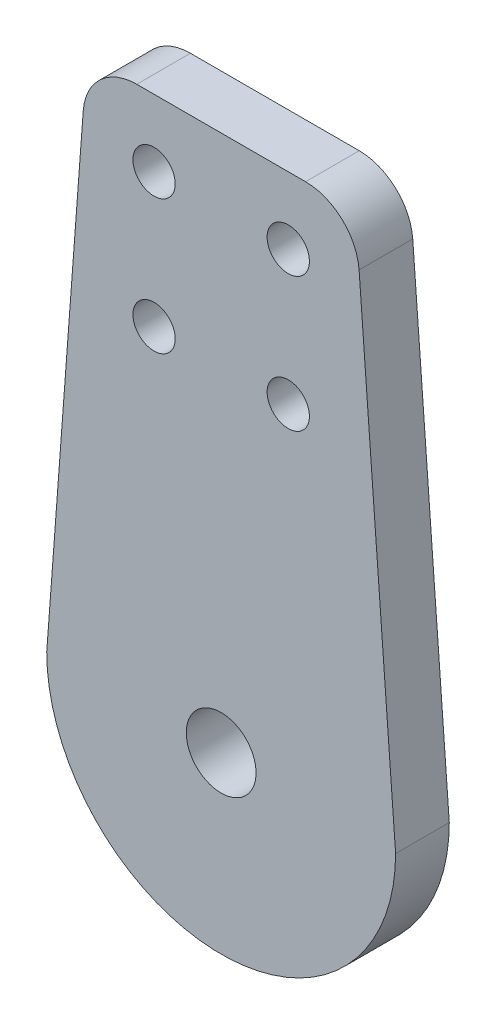
ISO-10303-21;
HEADER;
FILE_DESCRIPTION(('STEP AP214'),'2;1');
FILE_NAME('part.step','',(''),(''),'','','');
FILE_SCHEMA(('AUTOMOTIVE_DESIGN { 1 0 10303 214 1 1 1 1 }'));
ENDSEC;
DATA;
#1=APPLICATION_CONTEXT('core data for automotive mechanical design processes');
#2=APPLICATION_PROTOCOL_DEFINITION('international standard','automotive_design',2000,#1);
#3=PRODUCT_CONTEXT('',#1,'mechanical');
#4=PRODUCT('Part','Part','',(#3));
#5=PRODUCT_RELATED_PRODUCT_CATEGORY('part','',(#4));
#6=PRODUCT_DEFINITION_FORMATION('','',#4);
#7=PRODUCT_DEFINITION_CONTEXT('part definition',#1,'design');
#8=PRODUCT_DEFINITION('design','',#6,#7);
#9=PRODUCT_DEFINITION_SHAPE('','',#8);
#10=(LENGTH_UNIT() NAMED_UNIT(*) SI_UNIT(.MILLI.,.METRE.));
#11=(NAMED_UNIT(*) PLANE_ANGLE_UNIT() SI_UNIT($,.RADIAN.));
#12=(NAMED_UNIT(*) SI_UNIT($,.STERADIAN.) SOLID_ANGLE_UNIT());
#13=UNCERTAINTY_MEASURE_WITH_UNIT(LENGTH_MEASURE(1.E-05),#10,'distance_accuracy_value','');
#14=(GEOMETRIC_REPRESENTATION_CONTEXT(3) GLOBAL_UNCERTAINTY_ASSIGNED_CONTEXT((#13)) GLOBAL_UNIT_ASSIGNED_CONTEXT((#10,
#11,#12)) REPRESENTATION_CONTEXT('',''));
#15=CARTESIAN_POINT('',(0.,0.,0.));
#16=DIRECTION('',(0.,0.,1.));
#17=DIRECTION('',(1.,0.,0.));
#18=AXIS2_PLACEMENT_3D('',#15,#16,#17);
#19=CARTESIAN_POINT('',(0.,0.,4.));
#20=DIRECTION('',(0.,-1.,0.));
#21=DIRECTION('',(0.,0.,-1.));
#22=AXIS2_PLACEMENT_3D('',#19,#20,#21);
#23=PLANE('',#22);
#24=DIRECTION('',(-1.,0.,0.));
#25=VECTOR('',#24,1.);
#26=CARTESIAN_POINT('',(0.,0.,4.));
#27=LINE('',#26,#25);
#28=CARTESIAN_POINT('',(16.2887657759737,0.,4.));
#29=VERTEX_POINT('',#28);
#30=CARTESIAN_POINT('',(3.71123422402632,0.,4.));
#31=VERTEX_POINT('',#30);
#32=EDGE_CURVE('E151',#29,#31,#27,.T.);
#33=ORIENTED_EDGE('',*,*,#32,.F.);
#34=DIRECTION('',(0.,0.,-1.));
#35=VECTOR('',#34,1.);
#36=CARTESIAN_POINT('',(16.2887657759737,0.,4.));
#37=LINE('',#36,#35);
#38=CARTESIAN_POINT('',(16.2887657759737,0.,0.));
#39=VERTEX_POINT('',#38);
#40=EDGE_CURVE('E157',#29,#39,#37,.T.);
#41=ORIENTED_EDGE('',*,*,#40,.T.);
#42=DIRECTION('',(-1.,0.,0.));
#43=VECTOR('',#42,1.);
#44=CARTESIAN_POINT('',(0.,0.,0.));
#45=LINE('',#44,#43);
#46=CARTESIAN_POINT('',(3.71123422402632,0.,0.));
#47=VERTEX_POINT('',#46);
#48=EDGE_CURVE('E148',#39,#47,#45,.T.);
#49=ORIENTED_EDGE('',*,*,#48,.T.);
#50=DIRECTION('',(0.,0.,-1.));
#51=VECTOR('',#50,1.);
#52=CARTESIAN_POINT('',(3.71123422402632,0.,4.));
#53=LINE('',#52,#51);
#54=EDGE_CURVE('E153',#47,#31,#53,.F.);
#55=ORIENTED_EDGE('',*,*,#54,.T.);
#56=EDGE_LOOP('',(#33,#41,#49,#55));
#57=FACE_BOUND('',#56,.T.);
#58=ADVANCED_FACE('F42',(#57),#23,.F.);
#59=CARTESIAN_POINT('',(0.,0.,4.));
#60=DIRECTION('',(0.,0.,1.));
#61=DIRECTION('',(1.,0.,0.));
#62=AXIS2_PLACEMENT_3D('',#59,#60,#61);
#63=PLANE('',#62);
#64=CARTESIAN_POINT('',(10.,-40.,4.));
#65=DIRECTION('',(0.,0.,-1.));
#66=DIRECTION('',(-1.,0.,0.));
#67=AXIS2_PLACEMENT_3D('',#64,#65,#66);
#68=CIRCLE('',#67,2.6);
#69=CARTESIAN_POINT('',(7.4,-40.,4.));
#70=VERTEX_POINT('',#69);
#71=EDGE_CURVE('E123',#70,#70,#68,.T.);
#72=ORIENTED_EDGE('',*,*,#71,.T.);
#73=EDGE_LOOP('',(#72));
#74=FACE_BOUND('',#73,.T.);
#75=CARTESIAN_POINT('',(5.,-15.,4.));
#76=DIRECTION('',(0.,0.,1.));
#77=DIRECTION('',(-1.,0.,0.));
#78=AXIS2_PLACEMENT_3D('',#75,#76,#77);
#79=CIRCLE('',#78,1.575);
#80=CARTESIAN_POINT('',(3.425,-15.,4.));
#81=VERTEX_POINT('',#80);
#82=EDGE_CURVE('E139',#81,#81,#79,.T.);
#83=ORIENTED_EDGE('',*,*,#82,.F.);
#84=EDGE_LOOP('',(#83));
#85=FACE_BOUND('',#84,.T.);
#86=CARTESIAN_POINT('',(15.,-15.,4.));
#87=DIRECTION('',(0.,0.,1.));
#88=DIRECTION('',(1.,0.,0.));
#89=AXIS2_PLACEMENT_3D('',#86,#87,#88);
#90=CIRCLE('',#89,1.575);
#91=CARTESIAN_POINT('',(16.575,-15.,4.));
#92=VERTEX_POINT('',#91);
#93=EDGE_CURVE('E133',#92,#92,#90,.T.);
#94=ORIENTED_EDGE('',*,*,#93,.F.);
#95=EDGE_LOOP('',(#94));
#96=FACE_BOUND('',#95,.T.);
#97=CARTESIAN_POINT('',(15.,-5.,4.));
#98=DIRECTION('',(0.,0.,1.));
#99=DIRECTION('',(-1.,0.,0.));
#100=AXIS2_PLACEMENT_3D('',#97,#98,#99);
#101=CIRCLE('',#100,1.575);
#102=CARTESIAN_POINT('',(13.425,-5.,4.));
#103=VERTEX_POINT('',#102);
#104=EDGE_CURVE('E126',#103,#103,#101,.T.);
#105=ORIENTED_EDGE('',*,*,#104,.F.);
#106=EDGE_LOOP('',(#105));
#107=FACE_BOUND('',#106,.T.);
#108=CARTESIAN_POINT('',(5.,-5.,4.));
#109=DIRECTION('',(0.,0.,1.));
#110=DIRECTION('',(1.,0.,0.));
#111=AXIS2_PLACEMENT_3D('',#108,#109,#110);
#112=CIRCLE('',#111,1.575);
#113=CARTESIAN_POINT('',(6.575,-5.,4.));
#114=VERTEX_POINT('',#113);
#115=EDGE_CURVE('E129',#114,#114,#112,.T.);
#116=ORIENTED_EDGE('',*,*,#115,.F.);
#117=EDGE_LOOP('',(#116));
#118=FACE_BOUND('',#117,.T.);
#119=DIRECTION('',(-0.0747899482416342,0.997199309888456,0.));
#120=VECTOR('',#119,1.);
#121=CARTESIAN_POINT('',(19.8881292728403,1.49160969546302,4.));
#122=LINE('',#121,#120);
#123=CARTESIAN_POINT('',(23.,-40.,4.));
#124=VERTEX_POINT('',#123);
#125=CARTESIAN_POINT('',(20.2775630155275,-3.70084020703346,4.));
#126=VERTEX_POINT('',#125);
#127=EDGE_CURVE('E122',#124,#126,#122,.T.);
#128=ORIENTED_EDGE('',*,*,#127,.T.);
#129=CARTESIAN_POINT('',(16.2887657759737,-4.,4.));
#130=DIRECTION('',(0.,0.,1.));
#131=DIRECTION('',(1.,0.,0.));
#132=AXIS2_PLACEMENT_3D('',#129,#130,#131);
#133=CIRCLE('',#132,4.);
#134=EDGE_CURVE('E50',#126,#29,#133,.T.);
#135=ORIENTED_EDGE('',*,*,#134,.T.);
#136=ORIENTED_EDGE('',*,*,#32,.T.);
#137=CARTESIAN_POINT('',(3.71123422402632,-4.,4.));
#138=DIRECTION('',(0.,0.,1.));
#139=DIRECTION('',(1.,0.,0.));
#140=AXIS2_PLACEMENT_3D('',#137,#138,#139);
#141=CIRCLE('',#140,4.);
#142=CARTESIAN_POINT('',(-0.277563015527511,-3.70084020703346,4.));
#143=VERTEX_POINT('',#142);
#144=EDGE_CURVE('E57',#31,#143,#141,.T.);
#145=ORIENTED_EDGE('',*,*,#144,.T.);
#146=DIRECTION('',(0.0747899482416345,0.997199309888456,0.));
#147=VECTOR('',#146,1.);
#148=CARTESIAN_POINT('',(0.,0.,4.));
#149=LINE('',#148,#147);
#150=CARTESIAN_POINT('',(-3.00000000000001,-40.,4.));
#151=VERTEX_POINT('',#150);
#152=EDGE_CURVE('E95',#151,#143,#149,.T.);
#153=ORIENTED_EDGE('',*,*,#152,.F.);
#154=CARTESIAN_POINT('',(10.,-40.,4.));
#155=DIRECTION('',(0.,0.,1.));
#156=DIRECTION('',(1.,0.,0.));
#157=AXIS2_PLACEMENT_3D('',#154,#155,#156);
#158=CIRCLE('',#157,13.);
#159=EDGE_CURVE('E99',#124,#151,#158,.F.);
#160=ORIENTED_EDGE('',*,*,#159,.F.);
#161=EDGE_LOOP('',(#128,#135,#136,#145,#153,#160));
#162=FACE_BOUND('',#161,.T.);
#163=ADVANCED_FACE('F97',(#74,#85,#96,#107,#118,#162),#63,.T.);
#164=CARTESIAN_POINT('',(0.,0.,0.));
#165=DIRECTION('',(0.,0.,1.));
#166=DIRECTION('',(1.,0.,0.));
#167=AXIS2_PLACEMENT_3D('',#164,#165,#166);
#168=PLANE('',#167);
#169=CARTESIAN_POINT('',(10.,-40.,0.));
#170=DIRECTION('',(0.,0.,-1.));
#171=DIRECTION('',(-1.,0.,0.));
#172=AXIS2_PLACEMENT_3D('',#169,#170,#171);
#173=CIRCLE('',#172,2.6);
#174=CARTESIAN_POINT('',(7.4,-40.,0.));
#175=VERTEX_POINT('',#174);
#176=EDGE_CURVE('E203',#175,#175,#173,.T.);
#177=ORIENTED_EDGE('',*,*,#176,.F.);
#178=EDGE_LOOP('',(#177));
#179=FACE_BOUND('',#178,.T.);
#180=CARTESIAN_POINT('',(5.,-15.,0.));
#181=DIRECTION('',(0.,0.,1.));
#182=DIRECTION('',(-1.,0.,0.));
#183=AXIS2_PLACEMENT_3D('',#180,#181,#182);
#184=CIRCLE('',#183,1.575);
#185=CARTESIAN_POINT('',(3.425,-15.,0.));
#186=VERTEX_POINT('',#185);
#187=EDGE_CURVE('E142',#186,#186,#184,.T.);
#188=ORIENTED_EDGE('',*,*,#187,.T.);
#189=EDGE_LOOP('',(#188));
#190=FACE_BOUND('',#189,.T.);
#191=CARTESIAN_POINT('',(15.,-15.,0.));
#192=DIRECTION('',(0.,0.,1.));
#193=DIRECTION('',(1.,0.,0.));
#194=AXIS2_PLACEMENT_3D('',#191,#192,#193);
#195=CIRCLE('',#194,1.575);
#196=CARTESIAN_POINT('',(16.575,-15.,0.));
#197=VERTEX_POINT('',#196);
#198=EDGE_CURVE('E136',#197,#197,#195,.T.);
#199=ORIENTED_EDGE('',*,*,#198,.T.);
#200=EDGE_LOOP('',(#199));
#201=FACE_BOUND('',#200,.T.);
#202=CARTESIAN_POINT('',(15.,-5.,0.));
#203=DIRECTION('',(0.,0.,1.));
#204=DIRECTION('',(-1.,0.,0.));
#205=AXIS2_PLACEMENT_3D('',#202,#203,#204);
#206=CIRCLE('',#205,1.575);
#207=CARTESIAN_POINT('',(13.425,-5.,0.));
#208=VERTEX_POINT('',#207);
#209=EDGE_CURVE('E130',#208,#208,#206,.T.);
#210=ORIENTED_EDGE('',*,*,#209,.T.);
#211=EDGE_LOOP('',(#210));
#212=FACE_BOUND('',#211,.T.);
#213=CARTESIAN_POINT('',(5.,-5.,0.));
#214=DIRECTION('',(0.,0.,1.));
#215=DIRECTION('',(1.,0.,0.));
#216=AXIS2_PLACEMENT_3D('',#213,#214,#215);
#217=CIRCLE('',#216,1.575);
#218=CARTESIAN_POINT('',(6.575,-5.,0.));
#219=VERTEX_POINT('',#218);
#220=EDGE_CURVE('E145',#219,#219,#217,.T.);
#221=ORIENTED_EDGE('',*,*,#220,.T.);
#222=EDGE_LOOP('',(#221));
#223=FACE_BOUND('',#222,.T.);
#224=ORIENTED_EDGE('',*,*,#48,.F.);
#225=CARTESIAN_POINT('',(16.2887657759737,-4.,0.));
#226=DIRECTION('',(0.,0.,1.));
#227=DIRECTION('',(1.,0.,0.));
#228=AXIS2_PLACEMENT_3D('',#225,#226,#227);
#229=CIRCLE('',#228,4.);
#230=CARTESIAN_POINT('',(20.2775630155275,-3.70084020703346,0.));
#231=VERTEX_POINT('',#230);
#232=EDGE_CURVE('E162',#39,#231,#229,.F.);
#233=ORIENTED_EDGE('',*,*,#232,.T.);
#234=DIRECTION('',(-0.0747899482416342,0.997199309888456,0.));
#235=VECTOR('',#234,1.);
#236=CARTESIAN_POINT('',(19.8881292728403,1.49160969546302,0.));
#237=LINE('',#236,#235);
#238=CARTESIAN_POINT('',(23.,-40.,0.));
#239=VERTEX_POINT('',#238);
#240=EDGE_CURVE('E120',#239,#231,#237,.T.);
#241=ORIENTED_EDGE('',*,*,#240,.F.);
#242=CARTESIAN_POINT('',(10.,-40.,0.));
#243=DIRECTION('',(0.,0.,-1.));
#244=DIRECTION('',(-1.,0.,0.));
#245=AXIS2_PLACEMENT_3D('',#242,#243,#244);
#246=CIRCLE('',#245,13.);
#247=CARTESIAN_POINT('',(-3.00000000000001,-40.,0.));
#248=VERTEX_POINT('',#247);
#249=EDGE_CURVE('E116',#239,#248,#246,.T.);
#250=ORIENTED_EDGE('',*,*,#249,.T.);
#251=DIRECTION('',(0.0747899482416345,0.997199309888456,0.));
#252=VECTOR('',#251,1.);
#253=CARTESIAN_POINT('',(0.,0.,0.));
#254=LINE('',#253,#252);
#255=CARTESIAN_POINT('',(-0.277563015527511,-3.70084020703346,0.));
#256=VERTEX_POINT('',#255);
#257=EDGE_CURVE('E108',#248,#256,#254,.T.);
#258=ORIENTED_EDGE('',*,*,#257,.T.);
#259=CARTESIAN_POINT('',(3.71123422402632,-4.,0.));
#260=DIRECTION('',(0.,0.,1.));
#261=DIRECTION('',(1.,0.,0.));
#262=AXIS2_PLACEMENT_3D('',#259,#260,#261);
#263=CIRCLE('',#262,4.);
#264=EDGE_CURVE('E160',#256,#47,#263,.F.);
#265=ORIENTED_EDGE('',*,*,#264,.T.);
#266=EDGE_LOOP('',(#224,#233,#241,#250,#258,#265));
#267=FACE_BOUND('',#266,.T.);
#268=ADVANCED_FACE('F175',(#179,#190,#201,#212,#223,#267),#168,.F.);
#269=CARTESIAN_POINT('',(5.,-5.,0.));
#270=DIRECTION('',(0.,0.,1.));
#271=DIRECTION('',(1.,0.,0.));
#272=AXIS2_PLACEMENT_3D('',#269,#270,#271);
#273=CYLINDRICAL_SURFACE('',#272,1.575);
#274=ORIENTED_EDGE('',*,*,#220,.F.);
#275=EDGE_LOOP('',(#274));
#276=FACE_BOUND('',#275,.T.);
#277=ORIENTED_EDGE('',*,*,#115,.T.);
#278=EDGE_LOOP('',(#277));
#279=FACE_BOUND('',#278,.T.);
#280=ADVANCED_FACE('F214',(#276,#279),#273,.F.);
#281=CARTESIAN_POINT('',(15.,-5.,0.));
#282=DIRECTION('',(0.,0.,1.));
#283=DIRECTION('',(1.,0.,0.));
#284=AXIS2_PLACEMENT_3D('',#281,#282,#283);
#285=CYLINDRICAL_SURFACE('',#284,1.575);
#286=ORIENTED_EDGE('',*,*,#209,.F.);
#287=EDGE_LOOP('',(#286));
#288=FACE_BOUND('',#287,.T.);
#289=ORIENTED_EDGE('',*,*,#104,.T.);
#290=EDGE_LOOP('',(#289));
#291=FACE_BOUND('',#290,.T.);
#292=ADVANCED_FACE('F225',(#288,#291),#285,.F.);
#293=CARTESIAN_POINT('',(15.,-15.,0.));
#294=DIRECTION('',(0.,0.,1.));
#295=DIRECTION('',(1.,0.,0.));
#296=AXIS2_PLACEMENT_3D('',#293,#294,#295);
#297=CYLINDRICAL_SURFACE('',#296,1.575);
#298=ORIENTED_EDGE('',*,*,#198,.F.);
#299=EDGE_LOOP('',(#298));
#300=FACE_BOUND('',#299,.T.);
#301=ORIENTED_EDGE('',*,*,#93,.T.);
#302=EDGE_LOOP('',(#301));
#303=FACE_BOUND('',#302,.T.);
#304=ADVANCED_FACE('F232',(#300,#303),#297,.F.);
#305=CARTESIAN_POINT('',(5.,-15.,0.));
#306=DIRECTION('',(0.,0.,1.));
#307=DIRECTION('',(1.,0.,0.));
#308=AXIS2_PLACEMENT_3D('',#305,#306,#307);
#309=CYLINDRICAL_SURFACE('',#308,1.575);
#310=ORIENTED_EDGE('',*,*,#187,.F.);
#311=EDGE_LOOP('',(#310));
#312=FACE_BOUND('',#311,.T.);
#313=ORIENTED_EDGE('',*,*,#82,.T.);
#314=EDGE_LOOP('',(#313));
#315=FACE_BOUND('',#314,.T.);
#316=ADVANCED_FACE('F236',(#312,#315),#309,.F.);
#317=CARTESIAN_POINT('',(10.,-40.,63.0338885725818));
#318=DIRECTION('',(0.,0.,-1.));
#319=DIRECTION('',(-1.,0.,0.));
#320=AXIS2_PLACEMENT_3D('',#317,#318,#319);
#321=CYLINDRICAL_SURFACE('',#320,13.);
#322=DIRECTION('',(0.,0.,-1.));
#323=VECTOR('',#322,1.);
#324=CARTESIAN_POINT('',(23.,-40.,63.0338885725818));
#325=LINE('',#324,#323);
#326=EDGE_CURVE('E102',#124,#239,#325,.T.);
#327=ORIENTED_EDGE('',*,*,#326,.F.);
#328=ORIENTED_EDGE('',*,*,#159,.T.);
#329=DIRECTION('',(0.,0.,-1.));
#330=VECTOR('',#329,1.);
#331=CARTESIAN_POINT('',(-3.00000000000001,-40.,63.0338885725818));
#332=LINE('',#331,#330);
#333=EDGE_CURVE('E103',#151,#248,#332,.T.);
#334=ORIENTED_EDGE('',*,*,#333,.T.);
#335=ORIENTED_EDGE('',*,*,#249,.F.);
#336=EDGE_LOOP('',(#327,#328,#334,#335));
#337=FACE_BOUND('',#336,.T.);
#338=ADVANCED_FACE('F114',(#337),#321,.T.);
#339=CARTESIAN_POINT('',(0.,0.,63.0338885725818));
#340=DIRECTION('',(-0.997199309888456,0.0747899482416345,0.));
#341=DIRECTION('',(-0.0747899482416345,-0.997199309888456,0.));
#342=AXIS2_PLACEMENT_3D('',#339,#340,#341);
#343=PLANE('',#342);
#344=ORIENTED_EDGE('',*,*,#152,.T.);
#345=DIRECTION('',(0.,0.,-1.));
#346=VECTOR('',#345,1.);
#347=CARTESIAN_POINT('',(-0.277563015527511,-3.70084020703346,0.));
#348=LINE('',#347,#346);
#349=EDGE_CURVE('E11',#143,#256,#348,.T.);
#350=ORIENTED_EDGE('',*,*,#349,.T.);
#351=ORIENTED_EDGE('',*,*,#257,.F.);
#352=ORIENTED_EDGE('',*,*,#333,.F.);
#353=EDGE_LOOP('',(#344,#350,#351,#352));
#354=FACE_BOUND('',#353,.T.);
#355=ADVANCED_FACE('F106',(#354),#343,.T.);
#356=CARTESIAN_POINT('',(19.8881292728403,1.49160969546302,63.0338885725818));
#357=DIRECTION('',(-0.997199309888456,-0.0747899482416342,0.));
#358=DIRECTION('',(0.0747899482416342,-0.997199309888456,0.));
#359=AXIS2_PLACEMENT_3D('',#356,#357,#358);
#360=PLANE('',#359);
#361=ORIENTED_EDGE('',*,*,#240,.T.);
#362=DIRECTION('',(0.,0.,-1.));
#363=VECTOR('',#362,1.);
#364=CARTESIAN_POINT('',(20.2775630155275,-3.70084020703346,63.0338885725818));
#365=LINE('',#364,#363);
#366=EDGE_CURVE('E65',#231,#126,#365,.F.);
#367=ORIENTED_EDGE('',*,*,#366,.T.);
#368=ORIENTED_EDGE('',*,*,#127,.F.);
#369=ORIENTED_EDGE('',*,*,#326,.T.);
#370=EDGE_LOOP('',(#361,#367,#368,#369));
#371=FACE_BOUND('',#370,.T.);
#372=ADVANCED_FACE('F176',(#371),#360,.F.);
#373=CARTESIAN_POINT('',(10.,-40.,4.));
#374=DIRECTION('',(0.,0.,-1.));
#375=DIRECTION('',(-1.,0.,0.));
#376=AXIS2_PLACEMENT_3D('',#373,#374,#375);
#377=CYLINDRICAL_SURFACE('',#376,2.6);
#378=ORIENTED_EDGE('',*,*,#71,.F.);
#379=EDGE_LOOP('',(#378));
#380=FACE_BOUND('',#379,.T.);
#381=ORIENTED_EDGE('',*,*,#176,.T.);
#382=EDGE_LOOP('',(#381));
#383=FACE_BOUND('',#382,.T.);
#384=ADVANCED_FACE('F178',(#380,#383),#377,.F.);
#385=CARTESIAN_POINT('',(16.2887657759737,-4.,4.));
#386=DIRECTION('',(0.,0.,-1.));
#387=DIRECTION('',(-1.,0.,0.));
#388=AXIS2_PLACEMENT_3D('',#385,#386,#387);
#389=CYLINDRICAL_SURFACE('',#388,4.);
#390=ORIENTED_EDGE('',*,*,#134,.F.);
#391=ORIENTED_EDGE('',*,*,#366,.F.);
#392=ORIENTED_EDGE('',*,*,#232,.F.);
#393=ORIENTED_EDGE('',*,*,#40,.F.);
#394=EDGE_LOOP('',(#390,#391,#392,#393));
#395=FACE_BOUND('',#394,.T.);
#396=ADVANCED_FACE('F172',(#395),#389,.T.);
#397=CARTESIAN_POINT('',(3.71123422402632,-4.,63.0338885725818));
#398=DIRECTION('',(0.,0.,1.));
#399=DIRECTION('',(1.,0.,0.));
#400=AXIS2_PLACEMENT_3D('',#397,#398,#399);
#401=CYLINDRICAL_SURFACE('',#400,4.);
#402=ORIENTED_EDGE('',*,*,#144,.F.);
#403=ORIENTED_EDGE('',*,*,#54,.F.);
#404=ORIENTED_EDGE('',*,*,#264,.F.);
#405=ORIENTED_EDGE('',*,*,#349,.F.);
#406=EDGE_LOOP('',(#402,#403,#404,#405));
#407=FACE_BOUND('',#406,.T.);
#408=ADVANCED_FACE('F44',(#407),#401,.T.);
#409=CLOSED_SHELL('',(#58,#163,#268,#280,#292,#304,#316,#338,#355,#372,#384,#396,#408));
#410=MANIFOLD_SOLID_BREP('B2',#409);
#411=ADVANCED_BREP_SHAPE_REPRESENTATION('',(#18,#410),#14);
#412=SHAPE_DEFINITION_REPRESENTATION(#9,#411);
ENDSEC;
END-ISO-10303-21;
